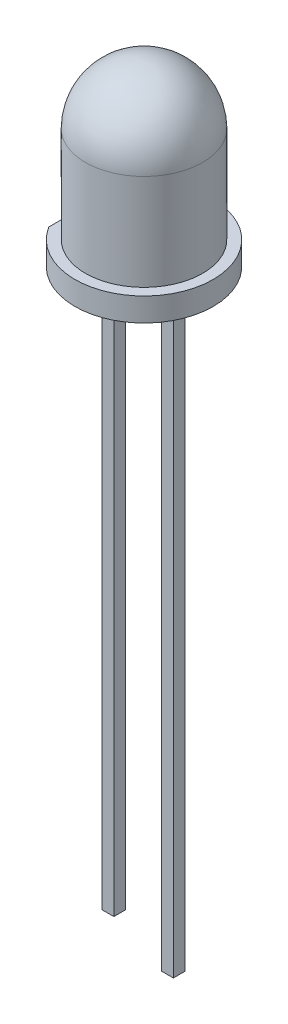
ISO-10303-21;
HEADER;
FILE_DESCRIPTION(('STEP AP214'),'2;1');
FILE_NAME('part.step','',(''),(''),'','','');
FILE_SCHEMA(('AUTOMOTIVE_DESIGN { 1 0 10303 214 1 1 1 1 }'));
ENDSEC;
DATA;
#1=APPLICATION_CONTEXT('core data for automotive mechanical design processes');
#2=APPLICATION_PROTOCOL_DEFINITION('international standard','automotive_design',2000,#1);
#3=PRODUCT_CONTEXT('',#1,'mechanical');
#4=PRODUCT('Part','Part','',(#3));
#5=PRODUCT_RELATED_PRODUCT_CATEGORY('part','',(#4));
#6=PRODUCT_DEFINITION_FORMATION('','',#4);
#7=PRODUCT_DEFINITION_CONTEXT('part definition',#1,'design');
#8=PRODUCT_DEFINITION('design','',#6,#7);
#9=PRODUCT_DEFINITION_SHAPE('','',#8);
#10=(LENGTH_UNIT() NAMED_UNIT(*) SI_UNIT(.MILLI.,.METRE.));
#11=(NAMED_UNIT(*) PLANE_ANGLE_UNIT() SI_UNIT($,.RADIAN.));
#12=(NAMED_UNIT(*) SI_UNIT($,.STERADIAN.) SOLID_ANGLE_UNIT());
#13=UNCERTAINTY_MEASURE_WITH_UNIT(LENGTH_MEASURE(1.E-05),#10,'distance_accuracy_value','');
#14=(GEOMETRIC_REPRESENTATION_CONTEXT(3) GLOBAL_UNCERTAINTY_ASSIGNED_CONTEXT((#13)) GLOBAL_UNIT_ASSIGNED_CONTEXT((#10,
#11,#12)) REPRESENTATION_CONTEXT('',''));
#15=CARTESIAN_POINT('',(0.,0.,0.));
#16=DIRECTION('',(0.,0.,1.));
#17=DIRECTION('',(1.,0.,0.));
#18=AXIS2_PLACEMENT_3D('',#15,#16,#17);
#19=CARTESIAN_POINT('',(0.,-919.589259581909,0.));
#20=DIRECTION('',(0.,-1.,0.));
#21=DIRECTION('',(0.,0.,-1.));
#22=AXIS2_PLACEMENT_3D('',#19,#20,#21);
#23=PLANE('',#22);
#24=DIRECTION('',(0.,0.,1.));
#25=VECTOR('',#24,1.);
#26=CARTESIAN_POINT('',(-2.5,-919.589259581909,0.));
#27=LINE('',#26,#25);
#28=CARTESIAN_POINT('',(-2.5,-919.589259581909,-1.56604597633658));
#29=VERTEX_POINT('',#28);
#30=CARTESIAN_POINT('',(-2.5,-919.589259581909,1.56604597633658));
#31=VERTEX_POINT('',#30);
#32=EDGE_CURVE('E185',#29,#31,#27,.T.);
#33=ORIENTED_EDGE('',*,*,#32,.F.);
#34=CARTESIAN_POINT('',(0.,-919.589259581909,0.));
#35=DIRECTION('',(0.,-1.,0.));
#36=DIRECTION('',(0.,0.,-1.));
#37=AXIS2_PLACEMENT_3D('',#34,#35,#36);
#38=CIRCLE('',#37,2.95);
#39=EDGE_CURVE('E11',#29,#31,#38,.T.);
#40=ORIENTED_EDGE('',*,*,#39,.T.);
#41=EDGE_LOOP('',(#33,#40));
#42=FACE_BOUND('',#41,.T.);
#43=DIRECTION('',(0.,0.,-1.));
#44=VECTOR('',#43,1.);
#45=CARTESIAN_POINT('',(1.02,-919.589259581909,-0.231185998967931));
#46=LINE('',#45,#44);
#47=CARTESIAN_POINT('',(1.02,-919.589259581909,0.268814001032069));
#48=VERTEX_POINT('',#47);
#49=CARTESIAN_POINT('',(1.02,-919.589259581909,-0.231185998967931));
#50=VERTEX_POINT('',#49);
#51=EDGE_CURVE('E151',#48,#50,#46,.T.);
#52=ORIENTED_EDGE('',*,*,#51,.F.);
#53=DIRECTION('',(-1.,0.,0.));
#54=VECTOR('',#53,1.);
#55=CARTESIAN_POINT('',(1.02,-919.589259581909,0.268814001032069));
#56=LINE('',#55,#54);
#57=CARTESIAN_POINT('',(1.52,-919.589259581909,0.268814001032069));
#58=VERTEX_POINT('',#57);
#59=EDGE_CURVE('E132',#58,#48,#56,.T.);
#60=ORIENTED_EDGE('',*,*,#59,.F.);
#61=DIRECTION('',(0.,0.,1.));
#62=VECTOR('',#61,1.);
#63=CARTESIAN_POINT('',(1.52,-919.589259581909,0.268814001032069));
#64=LINE('',#63,#62);
#65=CARTESIAN_POINT('',(1.52,-919.589259581909,-0.231185998967931));
#66=VERTEX_POINT('',#65);
#67=EDGE_CURVE('E142',#66,#58,#64,.T.);
#68=ORIENTED_EDGE('',*,*,#67,.F.);
#69=DIRECTION('',(1.,0.,0.));
#70=VECTOR('',#69,1.);
#71=CARTESIAN_POINT('',(1.52,-919.589259581909,-0.231185998967931));
#72=LINE('',#71,#70);
#73=EDGE_CURVE('E153',#50,#66,#72,.T.);
#74=ORIENTED_EDGE('',*,*,#73,.F.);
#75=EDGE_LOOP('',(#52,#60,#68,#74));
#76=FACE_BOUND('',#75,.T.);
#77=DIRECTION('',(-1.,0.,0.));
#78=VECTOR('',#77,1.);
#79=CARTESIAN_POINT('',(-1.52,-919.589259581909,0.268814001032069));
#80=LINE('',#79,#78);
#81=CARTESIAN_POINT('',(-1.02,-919.589259581909,0.268814001032069));
#82=VERTEX_POINT('',#81);
#83=CARTESIAN_POINT('',(-1.52,-919.589259581909,0.268814001032069));
#84=VERTEX_POINT('',#83);
#85=EDGE_CURVE('E128',#82,#84,#80,.T.);
#86=ORIENTED_EDGE('',*,*,#85,.F.);
#87=DIRECTION('',(0.,0.,1.));
#88=VECTOR('',#87,1.);
#89=CARTESIAN_POINT('',(-1.02,-919.589259581909,0.268814001032069));
#90=LINE('',#89,#88);
#91=CARTESIAN_POINT('',(-1.02,-919.589259581909,-0.231185998967931));
#92=VERTEX_POINT('',#91);
#93=EDGE_CURVE('E191',#92,#82,#90,.T.);
#94=ORIENTED_EDGE('',*,*,#93,.F.);
#95=DIRECTION('',(1.,0.,0.));
#96=VECTOR('',#95,1.);
#97=CARTESIAN_POINT('',(-1.02,-919.589259581909,-0.231185998967931));
#98=LINE('',#97,#96);
#99=CARTESIAN_POINT('',(-1.52,-919.589259581909,-0.231185998967931));
#100=VERTEX_POINT('',#99);
#101=EDGE_CURVE('E197',#100,#92,#98,.T.);
#102=ORIENTED_EDGE('',*,*,#101,.F.);
#103=DIRECTION('',(0.,0.,-1.));
#104=VECTOR('',#103,1.);
#105=CARTESIAN_POINT('',(-1.52,-919.589259581909,-0.231185998967931));
#106=LINE('',#105,#104);
#107=EDGE_CURVE('E195',#84,#100,#106,.T.);
#108=ORIENTED_EDGE('',*,*,#107,.F.);
#109=EDGE_LOOP('',(#86,#94,#102,#108));
#110=FACE_BOUND('',#109,.T.);
#111=ADVANCED_FACE('F32',(#42,#76,#110),#23,.T.);
#112=CARTESIAN_POINT('',(0.,-1491.47163397612,0.));
#113=DIRECTION('',(0.,-1.,0.));
#114=DIRECTION('',(0.,0.,-1.));
#115=AXIS2_PLACEMENT_3D('',#112,#113,#114);
#116=CYLINDRICAL_SURFACE('',#115,2.95);
#117=DIRECTION('',(0.,-1.,0.));
#118=VECTOR('',#117,1.);
#119=CARTESIAN_POINT('',(-2.5,-1491.47163397612,1.56604597633658));
#120=LINE('',#119,#118);
#121=CARTESIAN_POINT('',(-2.5,-918.589259581909,1.56604597633658));
#122=VERTEX_POINT('',#121);
#123=EDGE_CURVE('E178',#31,#122,#120,.F.);
#124=ORIENTED_EDGE('',*,*,#123,.F.);
#125=ORIENTED_EDGE('',*,*,#39,.F.);
#126=DIRECTION('',(0.,-1.,0.));
#127=VECTOR('',#126,1.);
#128=CARTESIAN_POINT('',(-2.5,-1491.47163397612,-1.56604597633658));
#129=LINE('',#128,#127);
#130=CARTESIAN_POINT('',(-2.5,-918.589259581909,-1.56604597633658));
#131=VERTEX_POINT('',#130);
#132=EDGE_CURVE('E179',#131,#29,#129,.T.);
#133=ORIENTED_EDGE('',*,*,#132,.F.);
#134=CARTESIAN_POINT('',(0.,-918.589259581909,0.));
#135=DIRECTION('',(0.,-1.,0.));
#136=DIRECTION('',(0.,0.,-1.));
#137=AXIS2_PLACEMENT_3D('',#134,#135,#136);
#138=CIRCLE('',#137,2.95);
#139=EDGE_CURVE('E39',#131,#122,#138,.T.);
#140=ORIENTED_EDGE('',*,*,#139,.T.);
#141=EDGE_LOOP('',(#124,#125,#133,#140));
#142=FACE_BOUND('',#141,.T.);
#143=ADVANCED_FACE('F176',(#142),#116,.T.);
#144=CARTESIAN_POINT('',(0.,-918.589259581909,-2.95));
#145=DIRECTION('',(0.,1.,0.));
#146=DIRECTION('',(0.,0.,1.));
#147=AXIS2_PLACEMENT_3D('',#144,#145,#146);
#148=PLANE('',#147);
#149=DIRECTION('',(0.,0.,-1.));
#150=VECTOR('',#149,1.);
#151=CARTESIAN_POINT('',(-2.5,-918.589259581909,2.50961933912005));
#152=LINE('',#151,#150);
#153=CARTESIAN_POINT('',(-2.5,-918.589259581909,0.));
#154=VERTEX_POINT('',#153);
#155=EDGE_CURVE('E54',#122,#154,#152,.T.);
#156=ORIENTED_EDGE('',*,*,#155,.F.);
#157=ORIENTED_EDGE('',*,*,#139,.F.);
#158=EDGE_CURVE('E182',#154,#131,#152,.T.);
#159=ORIENTED_EDGE('',*,*,#158,.F.);
#160=CARTESIAN_POINT('',(0.,-918.589259581909,0.));
#161=DIRECTION('',(0.,-1.,0.));
#162=DIRECTION('',(0.,0.,-1.));
#163=AXIS2_PLACEMENT_3D('',#160,#161,#162);
#164=CIRCLE('',#163,2.5);
#165=EDGE_CURVE('E169',#154,#154,#164,.T.);
#166=ORIENTED_EDGE('',*,*,#165,.T.);
#167=EDGE_LOOP('',(#156,#157,#159,#166));
#168=FACE_BOUND('',#167,.T.);
#169=ADVANCED_FACE('F181',(#168),#148,.T.);
#170=CARTESIAN_POINT('',(0.,-1491.47163397612,0.));
#171=DIRECTION('',(0.,-1.,0.));
#172=DIRECTION('',(0.,0.,-1.));
#173=AXIS2_PLACEMENT_3D('',#170,#171,#172);
#174=CYLINDRICAL_SURFACE('',#173,2.5);
#175=CARTESIAN_POINT('',(0.,-914.489259581906,0.));
#176=DIRECTION('',(0.,-1.,0.));
#177=DIRECTION('',(0.,0.,-1.));
#178=AXIS2_PLACEMENT_3D('',#175,#176,#177);
#179=CIRCLE('',#178,2.5);
#180=CARTESIAN_POINT('',(0.,-914.489259581906,-2.5));
#181=VERTEX_POINT('',#180);
#182=EDGE_CURVE('E166',#181,#181,#179,.T.);
#183=ORIENTED_EDGE('',*,*,#182,.T.);
#184=EDGE_LOOP('',(#183));
#185=FACE_BOUND('',#184,.T.);
#186=ORIENTED_EDGE('',*,*,#165,.F.);
#187=EDGE_LOOP('',(#186));
#188=FACE_BOUND('',#187,.T.);
#189=ADVANCED_FACE('F252',(#185,#188),#174,.T.);
#190=CARTESIAN_POINT('',(0.,-914.489259581906,0.));
#191=DIRECTION('',(0.,-1.,0.));
#192=DIRECTION('',(0.,0.,-1.));
#193=AXIS2_PLACEMENT_3D('',#190,#191,#192);
#194=SPHERICAL_SURFACE('',#193,2.49999999999853);
#195=ORIENTED_EDGE('',*,*,#182,.F.);
#196=EDGE_LOOP('',(#195));
#197=FACE_BOUND('',#196,.T.);
#198=ADVANCED_FACE('F249',(#197),#194,.T.);
#199=CARTESIAN_POINT('',(1.02,-944.989259581909,0.268814001032069));
#200=DIRECTION('',(0.,0.,-1.));
#201=DIRECTION('',(-1.,0.,0.));
#202=AXIS2_PLACEMENT_3D('',#199,#200,#201);
#203=PLANE('',#202);
#204=ORIENTED_EDGE('',*,*,#59,.T.);
#205=DIRECTION('',(0.,1.,0.));
#206=VECTOR('',#205,1.);
#207=CARTESIAN_POINT('',(1.02,-944.989259581909,0.268814001032069));
#208=LINE('',#207,#206);
#209=CARTESIAN_POINT('',(1.02,-944.989259581909,0.268814001032069));
#210=VERTEX_POINT('',#209);
#211=EDGE_CURVE('E164',#210,#48,#208,.T.);
#212=ORIENTED_EDGE('',*,*,#211,.F.);
#213=DIRECTION('',(-1.,0.,0.));
#214=VECTOR('',#213,1.);
#215=CARTESIAN_POINT('',(1.02,-944.989259581909,0.268814001032069));
#216=LINE('',#215,#214);
#217=CARTESIAN_POINT('',(1.52,-944.989259581909,0.268814001032069));
#218=VERTEX_POINT('',#217);
#219=EDGE_CURVE('E138',#218,#210,#216,.T.);
#220=ORIENTED_EDGE('',*,*,#219,.F.);
#221=DIRECTION('',(0.,1.,0.));
#222=VECTOR('',#221,1.);
#223=CARTESIAN_POINT('',(1.52,-944.989259581909,0.268814001032069));
#224=LINE('',#223,#222);
#225=EDGE_CURVE('E148',#218,#58,#224,.T.);
#226=ORIENTED_EDGE('',*,*,#225,.T.);
#227=EDGE_LOOP('',(#204,#212,#220,#226));
#228=FACE_BOUND('',#227,.T.);
#229=ADVANCED_FACE('F232',(#228),#203,.F.);
#230=CARTESIAN_POINT('',(1.02,-944.989259581909,-0.231185998967931));
#231=DIRECTION('',(1.,0.,0.));
#232=DIRECTION('',(0.,0.,-1.));
#233=AXIS2_PLACEMENT_3D('',#230,#231,#232);
#234=PLANE('',#233);
#235=ORIENTED_EDGE('',*,*,#51,.T.);
#236=DIRECTION('',(0.,1.,0.));
#237=VECTOR('',#236,1.);
#238=CARTESIAN_POINT('',(1.02,-944.989259581909,-0.231185998967931));
#239=LINE('',#238,#237);
#240=CARTESIAN_POINT('',(1.02,-944.989259581909,-0.231185998967931));
#241=VERTEX_POINT('',#240);
#242=EDGE_CURVE('E161',#241,#50,#239,.T.);
#243=ORIENTED_EDGE('',*,*,#242,.F.);
#244=DIRECTION('',(0.,0.,-1.));
#245=VECTOR('',#244,1.);
#246=CARTESIAN_POINT('',(1.02,-944.989259581909,-0.231185998967931));
#247=LINE('',#246,#245);
#248=EDGE_CURVE('E141',#210,#241,#247,.T.);
#249=ORIENTED_EDGE('',*,*,#248,.F.);
#250=ORIENTED_EDGE('',*,*,#211,.T.);
#251=EDGE_LOOP('',(#235,#243,#249,#250));
#252=FACE_BOUND('',#251,.T.);
#253=ADVANCED_FACE('F220',(#252),#234,.F.);
#254=CARTESIAN_POINT('',(1.52,-944.989259581909,-0.231185998967931));
#255=DIRECTION('',(0.,0.,1.));
#256=DIRECTION('',(1.,0.,0.));
#257=AXIS2_PLACEMENT_3D('',#254,#255,#256);
#258=PLANE('',#257);
#259=ORIENTED_EDGE('',*,*,#73,.T.);
#260=DIRECTION('',(0.,1.,0.));
#261=VECTOR('',#260,1.);
#262=CARTESIAN_POINT('',(1.52,-944.989259581909,-0.231185998967931));
#263=LINE('',#262,#261);
#264=CARTESIAN_POINT('',(1.52,-944.989259581909,-0.231185998967931));
#265=VERTEX_POINT('',#264);
#266=EDGE_CURVE('E159',#265,#66,#263,.T.);
#267=ORIENTED_EDGE('',*,*,#266,.F.);
#268=DIRECTION('',(1.,0.,0.));
#269=VECTOR('',#268,1.);
#270=CARTESIAN_POINT('',(1.52,-944.989259581909,-0.231185998967931));
#271=LINE('',#270,#269);
#272=EDGE_CURVE('E144',#241,#265,#271,.T.);
#273=ORIENTED_EDGE('',*,*,#272,.F.);
#274=ORIENTED_EDGE('',*,*,#242,.T.);
#275=EDGE_LOOP('',(#259,#267,#273,#274));
#276=FACE_BOUND('',#275,.T.);
#277=ADVANCED_FACE('F224',(#276),#258,.F.);
#278=CARTESIAN_POINT('',(1.52,-944.989259581909,0.268814001032069));
#279=DIRECTION('',(-1.,0.,0.));
#280=DIRECTION('',(0.,0.,1.));
#281=AXIS2_PLACEMENT_3D('',#278,#279,#280);
#282=PLANE('',#281);
#283=ORIENTED_EDGE('',*,*,#67,.T.);
#284=ORIENTED_EDGE('',*,*,#225,.F.);
#285=DIRECTION('',(0.,0.,1.));
#286=VECTOR('',#285,1.);
#287=CARTESIAN_POINT('',(1.52,-944.989259581909,0.268814001032069));
#288=LINE('',#287,#286);
#289=EDGE_CURVE('E146',#265,#218,#288,.T.);
#290=ORIENTED_EDGE('',*,*,#289,.F.);
#291=ORIENTED_EDGE('',*,*,#266,.T.);
#292=EDGE_LOOP('',(#283,#284,#290,#291));
#293=FACE_BOUND('',#292,.T.);
#294=ADVANCED_FACE('F234',(#293),#282,.F.);
#295=CARTESIAN_POINT('',(0.,-944.989259581909,0.));
#296=DIRECTION('',(0.,1.,0.));
#297=DIRECTION('',(0.,0.,1.));
#298=AXIS2_PLACEMENT_3D('',#295,#296,#297);
#299=PLANE('',#298);
#300=ORIENTED_EDGE('',*,*,#219,.T.);
#301=ORIENTED_EDGE('',*,*,#248,.T.);
#302=ORIENTED_EDGE('',*,*,#272,.T.);
#303=ORIENTED_EDGE('',*,*,#289,.T.);
#304=EDGE_LOOP('',(#300,#301,#302,#303));
#305=FACE_BOUND('',#304,.T.);
#306=ADVANCED_FACE('F228',(#305),#299,.F.);
#307=CARTESIAN_POINT('',(-1.02,-944.989259581909,0.268814001032069));
#308=DIRECTION('',(-1.,0.,0.));
#309=DIRECTION('',(0.,0.,1.));
#310=AXIS2_PLACEMENT_3D('',#307,#308,#309);
#311=PLANE('',#310);
#312=DIRECTION('',(0.,1.,0.));
#313=VECTOR('',#312,1.);
#314=CARTESIAN_POINT('',(-1.02,-944.989259581909,0.268814001032069));
#315=LINE('',#314,#313);
#316=CARTESIAN_POINT('',(-1.02,-943.989259581909,0.268814001032069));
#317=VERTEX_POINT('',#316);
#318=EDGE_CURVE('E130',#317,#82,#315,.T.);
#319=ORIENTED_EDGE('',*,*,#318,.F.);
#320=DIRECTION('',(0.,0.,1.));
#321=VECTOR('',#320,1.);
#322=CARTESIAN_POINT('',(-1.02,-943.989259581909,-2.951));
#323=LINE('',#322,#321);
#324=CARTESIAN_POINT('',(-1.02,-943.989259581909,-0.231185998967931));
#325=VERTEX_POINT('',#324);
#326=EDGE_CURVE('E112',#325,#317,#323,.T.);
#327=ORIENTED_EDGE('',*,*,#326,.F.);
#328=DIRECTION('',(0.,1.,0.));
#329=VECTOR('',#328,1.);
#330=CARTESIAN_POINT('',(-1.02,-944.989259581909,-0.231185998967931));
#331=LINE('',#330,#329);
#332=EDGE_CURVE('E134',#325,#92,#331,.T.);
#333=ORIENTED_EDGE('',*,*,#332,.T.);
#334=ORIENTED_EDGE('',*,*,#93,.T.);
#335=EDGE_LOOP('',(#319,#327,#333,#334));
#336=FACE_BOUND('',#335,.T.);
#337=ADVANCED_FACE('F201',(#336),#311,.F.);
#338=CARTESIAN_POINT('',(-1.52,-944.989259581909,0.268814001032069));
#339=DIRECTION('',(0.,0.,-1.));
#340=DIRECTION('',(-1.,0.,0.));
#341=AXIS2_PLACEMENT_3D('',#338,#339,#340);
#342=PLANE('',#341);
#343=DIRECTION('',(0.,1.,0.));
#344=VECTOR('',#343,1.);
#345=CARTESIAN_POINT('',(-1.52,-944.989259581909,0.268814001032069));
#346=LINE('',#345,#344);
#347=CARTESIAN_POINT('',(-1.52,-943.989259581909,0.268814001032069));
#348=VERTEX_POINT('',#347);
#349=EDGE_CURVE('E122',#348,#84,#346,.T.);
#350=ORIENTED_EDGE('',*,*,#349,.F.);
#351=DIRECTION('',(-1.,0.,0.));
#352=VECTOR('',#351,1.);
#353=CARTESIAN_POINT('',(-1.02,-943.989259581909,0.268814001032069));
#354=LINE('',#353,#352);
#355=EDGE_CURVE('E109',#317,#348,#354,.T.);
#356=ORIENTED_EDGE('',*,*,#355,.F.);
#357=ORIENTED_EDGE('',*,*,#318,.T.);
#358=ORIENTED_EDGE('',*,*,#85,.T.);
#359=EDGE_LOOP('',(#350,#356,#357,#358));
#360=FACE_BOUND('',#359,.T.);
#361=ADVANCED_FACE('F126',(#360),#342,.F.);
#362=CARTESIAN_POINT('',(-1.52,-944.989259581909,-0.231185998967931));
#363=DIRECTION('',(1.,0.,0.));
#364=DIRECTION('',(0.,0.,-1.));
#365=AXIS2_PLACEMENT_3D('',#362,#363,#364);
#366=PLANE('',#365);
#367=DIRECTION('',(0.,1.,0.));
#368=VECTOR('',#367,1.);
#369=CARTESIAN_POINT('',(-1.52,-944.989259581909,-0.231185998967931));
#370=LINE('',#369,#368);
#371=CARTESIAN_POINT('',(-1.52,-943.989259581909,-0.231185998967931));
#372=VERTEX_POINT('',#371);
#373=EDGE_CURVE('E124',#372,#100,#370,.T.);
#374=ORIENTED_EDGE('',*,*,#373,.F.);
#375=DIRECTION('',(0.,0.,1.));
#376=VECTOR('',#375,1.);
#377=CARTESIAN_POINT('',(-1.52,-943.989259581909,-2.951));
#378=LINE('',#377,#376);
#379=EDGE_CURVE('E46',#372,#348,#378,.T.);
#380=ORIENTED_EDGE('',*,*,#379,.T.);
#381=ORIENTED_EDGE('',*,*,#349,.T.);
#382=ORIENTED_EDGE('',*,*,#107,.T.);
#383=EDGE_LOOP('',(#374,#380,#381,#382));
#384=FACE_BOUND('',#383,.T.);
#385=ADVANCED_FACE('F120',(#384),#366,.F.);
#386=CARTESIAN_POINT('',(-1.02,-944.989259581909,-0.231185998967931));
#387=DIRECTION('',(0.,0.,1.));
#388=DIRECTION('',(1.,0.,0.));
#389=AXIS2_PLACEMENT_3D('',#386,#387,#388);
#390=PLANE('',#389);
#391=ORIENTED_EDGE('',*,*,#332,.F.);
#392=DIRECTION('',(1.,0.,0.));
#393=VECTOR('',#392,1.);
#394=CARTESIAN_POINT('',(-1.02,-943.989259581909,-0.231185998967931));
#395=LINE('',#394,#393);
#396=EDGE_CURVE('E116',#372,#325,#395,.T.);
#397=ORIENTED_EDGE('',*,*,#396,.F.);
#398=ORIENTED_EDGE('',*,*,#373,.T.);
#399=ORIENTED_EDGE('',*,*,#101,.T.);
#400=EDGE_LOOP('',(#391,#397,#398,#399));
#401=FACE_BOUND('',#400,.T.);
#402=ADVANCED_FACE('F205',(#401),#390,.F.);
#403=CARTESIAN_POINT('',(-2.5,-943.989259581909,2.50961933912005));
#404=DIRECTION('',(1.,0.,0.));
#405=DIRECTION('',(0.,0.,-1.));
#406=AXIS2_PLACEMENT_3D('',#403,#404,#405);
#407=PLANE('',#406);
#408=ORIENTED_EDGE('',*,*,#123,.T.);
#409=ORIENTED_EDGE('',*,*,#155,.T.);
#410=ORIENTED_EDGE('',*,*,#158,.T.);
#411=ORIENTED_EDGE('',*,*,#132,.T.);
#412=ORIENTED_EDGE('',*,*,#32,.T.);
#413=EDGE_LOOP('',(#408,#409,#410,#411,#412));
#414=FACE_BOUND('',#413,.T.);
#415=ADVANCED_FACE('F336',(#414),#407,.F.);
#416=CARTESIAN_POINT('',(-1.02,-943.989259581909,-2.951));
#417=DIRECTION('',(0.,1.,0.));
#418=DIRECTION('',(0.,0.,1.));
#419=AXIS2_PLACEMENT_3D('',#416,#417,#418);
#420=PLANE('',#419);
#421=ORIENTED_EDGE('',*,*,#396,.T.);
#422=ORIENTED_EDGE('',*,*,#326,.T.);
#423=ORIENTED_EDGE('',*,*,#355,.T.);
#424=ORIENTED_EDGE('',*,*,#379,.F.);
#425=EDGE_LOOP('',(#421,#422,#423,#424));
#426=FACE_BOUND('',#425,.T.);
#427=ADVANCED_FACE('F110',(#426),#420,.F.);
#428=CLOSED_SHELL('',(#111,#143,#169,#189,#198,#229,#253,#277,#294,#306,#337,#361,#385,#402,
#415,#427));
#429=MANIFOLD_SOLID_BREP('B2',#428);
#430=ADVANCED_BREP_SHAPE_REPRESENTATION('',(#18,#429),#14);
#431=SHAPE_DEFINITION_REPRESENTATION(#9,#430);
ENDSEC;
END-ISO-10303-21;
